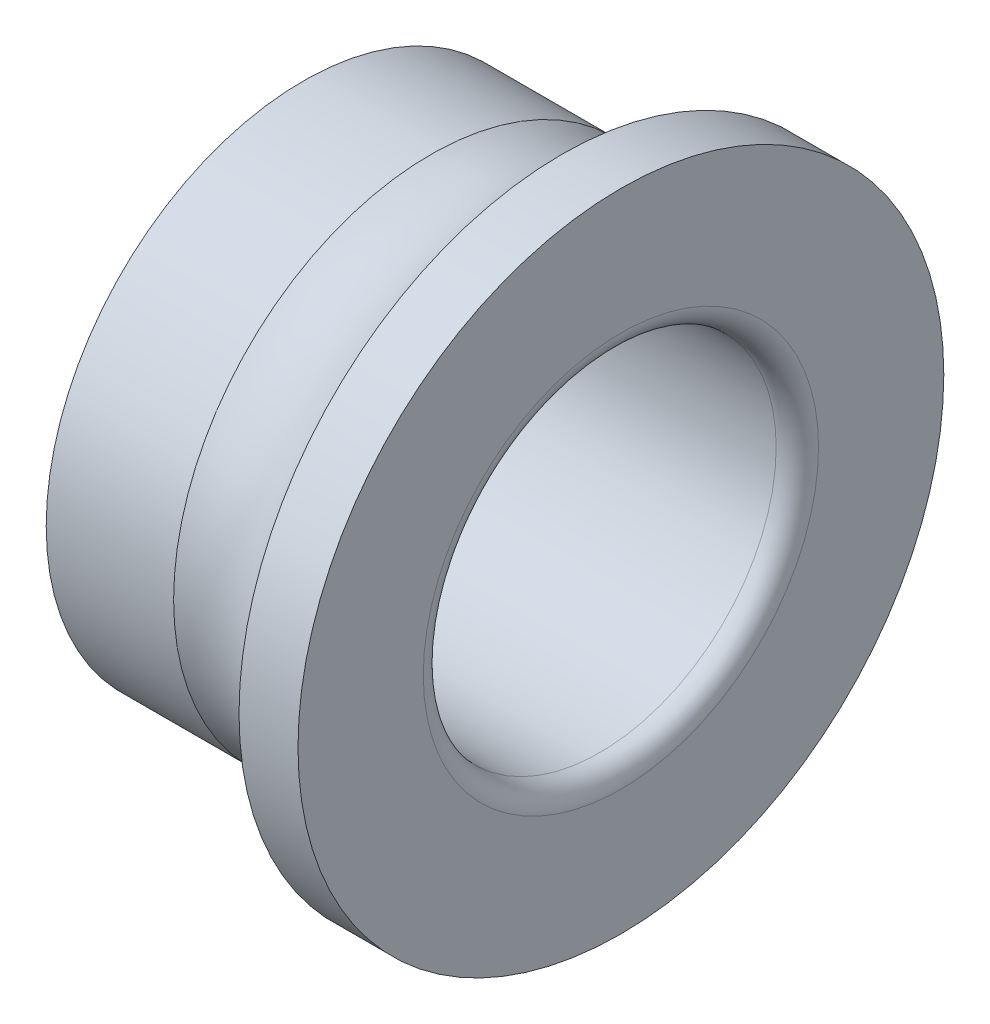
ISO-10303-21;
HEADER;
FILE_DESCRIPTION(('STEP AP214'),'2;1');
FILE_NAME('part.step','',(''),(''),'','','');
FILE_SCHEMA(('AUTOMOTIVE_DESIGN { 1 0 10303 214 1 1 1 1 }'));
ENDSEC;
DATA;
#1=APPLICATION_CONTEXT('core data for automotive mechanical design processes');
#2=APPLICATION_PROTOCOL_DEFINITION('international standard','automotive_design',2000,#1);
#3=PRODUCT_CONTEXT('',#1,'mechanical');
#4=PRODUCT('Part','Part','',(#3));
#5=PRODUCT_RELATED_PRODUCT_CATEGORY('part','',(#4));
#6=PRODUCT_DEFINITION_FORMATION('','',#4);
#7=PRODUCT_DEFINITION_CONTEXT('part definition',#1,'design');
#8=PRODUCT_DEFINITION('design','',#6,#7);
#9=PRODUCT_DEFINITION_SHAPE('','',#8);
#10=(LENGTH_UNIT() NAMED_UNIT(*) SI_UNIT(.MILLI.,.METRE.));
#11=(NAMED_UNIT(*) PLANE_ANGLE_UNIT() SI_UNIT($,.RADIAN.));
#12=(NAMED_UNIT(*) SI_UNIT($,.STERADIAN.) SOLID_ANGLE_UNIT());
#13=UNCERTAINTY_MEASURE_WITH_UNIT(LENGTH_MEASURE(1.E-05),#10,'distance_accuracy_value','');
#14=(GEOMETRIC_REPRESENTATION_CONTEXT(3) GLOBAL_UNCERTAINTY_ASSIGNED_CONTEXT((#13)) GLOBAL_UNIT_ASSIGNED_CONTEXT((#10,
#11,#12)) REPRESENTATION_CONTEXT('',''));
#15=CARTESIAN_POINT('',(0.,0.,0.));
#16=DIRECTION('',(0.,0.,1.));
#17=DIRECTION('',(1.,0.,0.));
#18=AXIS2_PLACEMENT_3D('',#15,#16,#17);
#19=CARTESIAN_POINT('',(9.,0.,0.));
#20=DIRECTION('',(-1.,0.,0.));
#21=DIRECTION('',(0.,0.,1.));
#22=AXIS2_PLACEMENT_3D('',#19,#20,#21);
#23=CYLINDRICAL_SURFACE('',#22,7.285);
#24=CARTESIAN_POINT('',(0.,0.,0.));
#25=DIRECTION('',(-1.,0.,0.));
#26=DIRECTION('',(0.,0.,1.));
#27=AXIS2_PLACEMENT_3D('',#24,#25,#26);
#28=CIRCLE('',#27,7.285);
#29=CARTESIAN_POINT('',(0.,0.,7.285));
#30=VERTEX_POINT('',#29);
#31=EDGE_CURVE('E10',#30,#30,#28,.T.);
#32=ORIENTED_EDGE('',*,*,#31,.F.);
#33=EDGE_LOOP('',(#32));
#34=FACE_BOUND('',#33,.T.);
#35=CARTESIAN_POINT('',(3.6101826030022,0.,0.));
#36=DIRECTION('',(-1.,0.,0.));
#37=DIRECTION('',(0.,0.,1.));
#38=AXIS2_PLACEMENT_3D('',#35,#36,#37);
#39=CIRCLE('',#38,7.285);
#40=CARTESIAN_POINT('',(3.6101826030022,0.,7.285));
#41=VERTEX_POINT('',#40);
#42=EDGE_CURVE('E59',#41,#41,#39,.T.);
#43=ORIENTED_EDGE('',*,*,#42,.T.);
#44=EDGE_LOOP('',(#43));
#45=FACE_BOUND('',#44,.T.);
#46=ADVANCED_FACE('F31',(#34,#45),#23,.T.);
#47=CARTESIAN_POINT('',(0.,7.285,0.));
#48=DIRECTION('',(1.,0.,0.));
#49=DIRECTION('',(0.,0.,-1.));
#50=AXIS2_PLACEMENT_3D('',#47,#48,#49);
#51=PLANE('',#50);
#52=CARTESIAN_POINT('',(0.,0.,0.));
#53=DIRECTION('',(-1.,0.,0.));
#54=DIRECTION('',(0.,0.,1.));
#55=AXIS2_PLACEMENT_3D('',#52,#53,#54);
#56=CIRCLE('',#55,5.6);
#57=CARTESIAN_POINT('',(0.,0.,5.6));
#58=VERTEX_POINT('',#57);
#59=EDGE_CURVE('E37',#58,#58,#56,.T.);
#60=ORIENTED_EDGE('',*,*,#59,.F.);
#61=EDGE_LOOP('',(#60));
#62=FACE_BOUND('',#61,.T.);
#63=ORIENTED_EDGE('',*,*,#31,.T.);
#64=EDGE_LOOP('',(#63));
#65=FACE_BOUND('',#64,.T.);
#66=ADVANCED_FACE('F96',(#62,#65),#51,.F.);
#67=CARTESIAN_POINT('',(0.600000000000047,0.,0.));
#68=DIRECTION('',(-1.,0.,0.));
#69=DIRECTION('',(0.,0.,1.));
#70=AXIS2_PLACEMENT_3D('',#67,#68,#69);
#71=TOROIDAL_SURFACE('',#70,5.60000000000005,0.600000000000047);
#72=CARTESIAN_POINT('',(0.6,0.,0.));
#73=DIRECTION('',(-1.,0.,0.));
#74=DIRECTION('',(0.,0.,1.));
#75=AXIS2_PLACEMENT_3D('',#72,#73,#74);
#76=CIRCLE('',#75,5.);
#77=CARTESIAN_POINT('',(0.6,0.,5.));
#78=VERTEX_POINT('',#77);
#79=EDGE_CURVE('E41',#78,#78,#76,.T.);
#80=ORIENTED_EDGE('',*,*,#79,.F.);
#81=EDGE_LOOP('',(#80));
#82=FACE_BOUND('',#81,.T.);
#83=ORIENTED_EDGE('',*,*,#59,.T.);
#84=EDGE_LOOP('',(#83));
#85=FACE_BOUND('',#84,.T.);
#86=ADVANCED_FACE('F91',(#82,#85),#71,.T.);
#87=CARTESIAN_POINT('',(9.,0.,0.));
#88=DIRECTION('',(-1.,0.,0.));
#89=DIRECTION('',(0.,0.,1.));
#90=AXIS2_PLACEMENT_3D('',#87,#88,#89);
#91=CYLINDRICAL_SURFACE('',#90,5.);
#92=CARTESIAN_POINT('',(8.4,0.,0.));
#93=DIRECTION('',(-1.,0.,0.));
#94=DIRECTION('',(0.,0.,1.));
#95=AXIS2_PLACEMENT_3D('',#92,#93,#94);
#96=CIRCLE('',#95,5.);
#97=CARTESIAN_POINT('',(8.4,0.,5.));
#98=VERTEX_POINT('',#97);
#99=EDGE_CURVE('E45',#98,#98,#96,.T.);
#100=ORIENTED_EDGE('',*,*,#99,.F.);
#101=EDGE_LOOP('',(#100));
#102=FACE_BOUND('',#101,.T.);
#103=ORIENTED_EDGE('',*,*,#79,.T.);
#104=EDGE_LOOP('',(#103));
#105=FACE_BOUND('',#104,.T.);
#106=ADVANCED_FACE('F85',(#102,#105),#91,.F.);
#107=CARTESIAN_POINT('',(8.3999999999999,0.,0.));
#108=DIRECTION('',(-1.,0.,0.));
#109=DIRECTION('',(0.,0.,1.));
#110=AXIS2_PLACEMENT_3D('',#107,#108,#109);
#111=TOROIDAL_SURFACE('',#110,5.6000000000001,0.600000000000096);
#112=CARTESIAN_POINT('',(9.,0.,0.));
#113=DIRECTION('',(-1.,0.,0.));
#114=DIRECTION('',(0.,0.,1.));
#115=AXIS2_PLACEMENT_3D('',#112,#113,#114);
#116=CIRCLE('',#115,5.6000000000001);
#117=CARTESIAN_POINT('',(9.,0.,5.6000000000001));
#118=VERTEX_POINT('',#117);
#119=EDGE_CURVE('E50',#118,#118,#116,.T.);
#120=ORIENTED_EDGE('',*,*,#119,.F.);
#121=EDGE_LOOP('',(#120));
#122=FACE_BOUND('',#121,.T.);
#123=ORIENTED_EDGE('',*,*,#99,.T.);
#124=EDGE_LOOP('',(#123));
#125=FACE_BOUND('',#124,.T.);
#126=ADVANCED_FACE('F79',(#122,#125),#111,.T.);
#127=CARTESIAN_POINT('',(9.,5.6,0.));
#128=DIRECTION('',(-1.,0.,0.));
#129=DIRECTION('',(0.,0.,1.));
#130=AXIS2_PLACEMENT_3D('',#127,#128,#129);
#131=PLANE('',#130);
#132=CARTESIAN_POINT('',(9.,0.,0.));
#133=DIRECTION('',(-1.,0.,0.));
#134=DIRECTION('',(0.,0.,1.));
#135=AXIS2_PLACEMENT_3D('',#132,#133,#134);
#136=CIRCLE('',#135,9.15);
#137=CARTESIAN_POINT('',(9.,0.,9.15));
#138=VERTEX_POINT('',#137);
#139=EDGE_CURVE('E53',#138,#138,#136,.T.);
#140=ORIENTED_EDGE('',*,*,#139,.F.);
#141=EDGE_LOOP('',(#140));
#142=FACE_BOUND('',#141,.T.);
#143=ORIENTED_EDGE('',*,*,#119,.T.);
#144=EDGE_LOOP('',(#143));
#145=FACE_BOUND('',#144,.T.);
#146=ADVANCED_FACE('F73',(#142,#145),#131,.F.);
#147=CARTESIAN_POINT('',(9.,0.,0.));
#148=DIRECTION('',(-1.,0.,0.));
#149=DIRECTION('',(0.,0.,1.));
#150=AXIS2_PLACEMENT_3D('',#147,#148,#149);
#151=CYLINDRICAL_SURFACE('',#150,9.15);
#152=CARTESIAN_POINT('',(7.3284271247462,0.,0.));
#153=DIRECTION('',(-1.,0.,0.));
#154=DIRECTION('',(0.,0.,1.));
#155=AXIS2_PLACEMENT_3D('',#152,#153,#154);
#156=CIRCLE('',#155,9.15);
#157=CARTESIAN_POINT('',(7.3284271247462,0.,9.15));
#158=VERTEX_POINT('',#157);
#159=EDGE_CURVE('E56',#158,#158,#156,.T.);
#160=ORIENTED_EDGE('',*,*,#159,.F.);
#161=EDGE_LOOP('',(#160));
#162=FACE_BOUND('',#161,.T.);
#163=ORIENTED_EDGE('',*,*,#139,.T.);
#164=EDGE_LOOP('',(#163));
#165=FACE_BOUND('',#164,.T.);
#166=ADVANCED_FACE('F67',(#162,#165),#151,.T.);
#167=CARTESIAN_POINT('',(4.50000000000002,0.,0.));
#168=DIRECTION('',(-1.,0.,0.));
#169=DIRECTION('',(0.,0.,1.));
#170=AXIS2_PLACEMENT_3D('',#167,#168,#169);
#171=TOROIDAL_SURFACE('',#170,10.15,2.99999999999999);
#172=ORIENTED_EDGE('',*,*,#42,.F.);
#173=EDGE_LOOP('',(#172));
#174=FACE_BOUND('',#173,.T.);
#175=ORIENTED_EDGE('',*,*,#159,.T.);
#176=EDGE_LOOP('',(#175));
#177=FACE_BOUND('',#176,.T.);
#178=ADVANCED_FACE('F64',(#174,#177),#171,.F.);
#179=CLOSED_SHELL('',(#46,#66,#86,#106,#126,#146,#166,#178));
#180=MANIFOLD_SOLID_BREP('B2',#179);
#181=ADVANCED_BREP_SHAPE_REPRESENTATION('',(#18,#180),#14);
#182=SHAPE_DEFINITION_REPRESENTATION(#9,#181);
ENDSEC;
END-ISO-10303-21;
